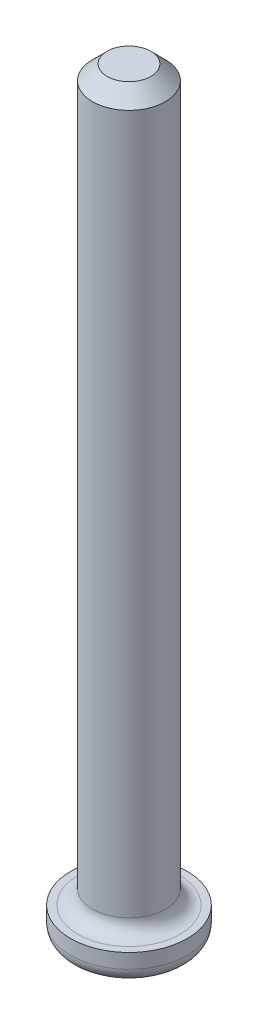
ISO-10303-21;
HEADER;
FILE_DESCRIPTION(('STEP AP214'),'2;1');
FILE_NAME('part.step','',(''),(''),'','','');
FILE_SCHEMA(('AUTOMOTIVE_DESIGN { 1 0 10303 214 1 1 1 1 }'));
ENDSEC;
DATA;
#1=APPLICATION_CONTEXT('core data for automotive mechanical design processes');
#2=APPLICATION_PROTOCOL_DEFINITION('international standard','automotive_design',2000,#1);
#3=PRODUCT_CONTEXT('',#1,'mechanical');
#4=PRODUCT('Part','Part','',(#3));
#5=PRODUCT_RELATED_PRODUCT_CATEGORY('part','',(#4));
#6=PRODUCT_DEFINITION_FORMATION('','',#4);
#7=PRODUCT_DEFINITION_CONTEXT('part definition',#1,'design');
#8=PRODUCT_DEFINITION('design','',#6,#7);
#9=PRODUCT_DEFINITION_SHAPE('','',#8);
#10=(LENGTH_UNIT() NAMED_UNIT(*) SI_UNIT(.MILLI.,.METRE.));
#11=(NAMED_UNIT(*) PLANE_ANGLE_UNIT() SI_UNIT($,.RADIAN.));
#12=(NAMED_UNIT(*) SI_UNIT($,.STERADIAN.) SOLID_ANGLE_UNIT());
#13=UNCERTAINTY_MEASURE_WITH_UNIT(LENGTH_MEASURE(1.E-05),#10,'distance_accuracy_value','');
#14=(GEOMETRIC_REPRESENTATION_CONTEXT(3) GLOBAL_UNCERTAINTY_ASSIGNED_CONTEXT((#13)) GLOBAL_UNIT_ASSIGNED_CONTEXT((#10,
#11,#12)) REPRESENTATION_CONTEXT('',''));
#15=CARTESIAN_POINT('',(0.,0.,0.));
#16=DIRECTION('',(0.,0.,1.));
#17=DIRECTION('',(1.,0.,0.));
#18=AXIS2_PLACEMENT_3D('',#15,#16,#17);
#19=CARTESIAN_POINT('',(0.,2.,0.));
#20=DIRECTION('',(0.,-1.,0.));
#21=DIRECTION('',(0.,0.,-1.));
#22=AXIS2_PLACEMENT_3D('',#19,#20,#21);
#23=CYLINDRICAL_SURFACE('',#22,4.);
#24=CARTESIAN_POINT('',(0.,1.,0.));
#25=DIRECTION('',(0.,1.,0.));
#26=DIRECTION('',(0.,0.,1.));
#27=AXIS2_PLACEMENT_3D('',#24,#25,#26);
#28=CIRCLE('',#27,4.);
#29=CARTESIAN_POINT('',(0.,1.,4.));
#30=VERTEX_POINT('',#29);
#31=EDGE_CURVE('E45',#30,#30,#28,.T.);
#32=ORIENTED_EDGE('',*,*,#31,.T.);
#33=EDGE_LOOP('',(#32));
#34=FACE_BOUND('',#33,.T.);
#35=CARTESIAN_POINT('',(0.,2.,0.));
#36=DIRECTION('',(0.,1.,0.));
#37=DIRECTION('',(0.,0.,1.));
#38=AXIS2_PLACEMENT_3D('',#35,#36,#37);
#39=CIRCLE('',#38,4.);
#40=CARTESIAN_POINT('',(0.,2.,4.));
#41=VERTEX_POINT('',#40);
#42=EDGE_CURVE('E69',#41,#41,#39,.T.);
#43=ORIENTED_EDGE('',*,*,#42,.F.);
#44=EDGE_LOOP('',(#43));
#45=FACE_BOUND('',#44,.T.);
#46=ADVANCED_FACE('F37',(#34,#45),#23,.T.);
#47=CARTESIAN_POINT('',(0.,2.,0.));
#48=DIRECTION('',(0.,1.,0.));
#49=DIRECTION('',(0.,0.,1.));
#50=AXIS2_PLACEMENT_3D('',#47,#48,#49);
#51=PLANE('',#50);
#52=CARTESIAN_POINT('',(0.,2.,0.));
#53=DIRECTION('',(0.,1.,0.));
#54=DIRECTION('',(0.,0.,1.));
#55=AXIS2_PLACEMENT_3D('',#52,#53,#54);
#56=CIRCLE('',#55,3.5);
#57=CARTESIAN_POINT('',(0.,2.,3.5));
#58=VERTEX_POINT('',#57);
#59=EDGE_CURVE('E61',#58,#58,#56,.F.);
#60=ORIENTED_EDGE('',*,*,#59,.T.);
#61=EDGE_LOOP('',(#60));
#62=FACE_BOUND('',#61,.T.);
#63=ORIENTED_EDGE('',*,*,#42,.T.);
#64=EDGE_LOOP('',(#63));
#65=FACE_BOUND('',#64,.T.);
#66=ADVANCED_FACE('F74',(#62,#65),#51,.T.);
#67=CARTESIAN_POINT('',(0.,0.,0.));
#68=DIRECTION('',(0.,1.,0.));
#69=DIRECTION('',(0.,0.,1.));
#70=AXIS2_PLACEMENT_3D('',#67,#68,#69);
#71=PLANE('',#70);
#72=CARTESIAN_POINT('',(0.,0.,0.));
#73=DIRECTION('',(0.,1.,0.));
#74=DIRECTION('',(0.,0.,1.));
#75=AXIS2_PLACEMENT_3D('',#72,#73,#74);
#76=CIRCLE('',#75,3.);
#77=CARTESIAN_POINT('',(0.,0.,3.));
#78=VERTEX_POINT('',#77);
#79=EDGE_CURVE('E10',#78,#78,#76,.F.);
#80=ORIENTED_EDGE('',*,*,#79,.T.);
#81=EDGE_LOOP('',(#80));
#82=FACE_BOUND('',#81,.T.);
#83=ADVANCED_FACE('F81',(#82),#71,.F.);
#84=CARTESIAN_POINT('',(0.,52.,0.));
#85=DIRECTION('',(0.,-1.,0.));
#86=DIRECTION('',(0.,0.,-1.));
#87=AXIS2_PLACEMENT_3D('',#84,#85,#86);
#88=CYLINDRICAL_SURFACE('',#87,2.5);
#89=CARTESIAN_POINT('',(0.,51.,0.));
#90=DIRECTION('',(0.,1.,0.));
#91=DIRECTION('',(0.,0.,1.));
#92=AXIS2_PLACEMENT_3D('',#89,#90,#91);
#93=CIRCLE('',#92,2.5);
#94=CARTESIAN_POINT('',(0.,51.,2.5));
#95=VERTEX_POINT('',#94);
#96=EDGE_CURVE('E50',#95,#95,#93,.F.);
#97=ORIENTED_EDGE('',*,*,#96,.T.);
#98=EDGE_LOOP('',(#97));
#99=FACE_BOUND('',#98,.T.);
#100=CARTESIAN_POINT('',(0.,3.,0.));
#101=DIRECTION('',(0.,1.,0.));
#102=DIRECTION('',(0.,0.,1.));
#103=AXIS2_PLACEMENT_3D('',#100,#101,#102);
#104=CIRCLE('',#103,2.5);
#105=CARTESIAN_POINT('',(0.,3.,2.5));
#106=VERTEX_POINT('',#105);
#107=EDGE_CURVE('E65',#106,#106,#104,.T.);
#108=ORIENTED_EDGE('',*,*,#107,.T.);
#109=EDGE_LOOP('',(#108));
#110=FACE_BOUND('',#109,.T.);
#111=ADVANCED_FACE('F102',(#99,#110),#88,.T.);
#112=CARTESIAN_POINT('',(0.,52.,0.));
#113=DIRECTION('',(0.,1.,0.));
#114=DIRECTION('',(0.,0.,1.));
#115=AXIS2_PLACEMENT_3D('',#112,#113,#114);
#116=PLANE('',#115);
#117=CARTESIAN_POINT('',(0.,52.,0.));
#118=DIRECTION('',(0.,1.,0.));
#119=DIRECTION('',(0.,0.,1.));
#120=AXIS2_PLACEMENT_3D('',#117,#118,#119);
#121=CIRCLE('',#120,1.50000000000001);
#122=CARTESIAN_POINT('',(0.,52.,1.50000000000001));
#123=VERTEX_POINT('',#122);
#124=EDGE_CURVE('E55',#123,#123,#121,.T.);
#125=ORIENTED_EDGE('',*,*,#124,.T.);
#126=EDGE_LOOP('',(#125));
#127=FACE_BOUND('',#126,.T.);
#128=ADVANCED_FACE('F89',(#127),#116,.T.);
#129=CARTESIAN_POINT('',(0.,3.,0.));
#130=DIRECTION('',(0.,1.,0.));
#131=DIRECTION('',(0.,0.,1.));
#132=AXIS2_PLACEMENT_3D('',#129,#130,#131);
#133=TOROIDAL_SURFACE('',#132,3.5,1.);
#134=ORIENTED_EDGE('',*,*,#59,.F.);
#135=EDGE_LOOP('',(#134));
#136=FACE_BOUND('',#135,.T.);
#137=ORIENTED_EDGE('',*,*,#107,.F.);
#138=EDGE_LOOP('',(#137));
#139=FACE_BOUND('',#138,.T.);
#140=ADVANCED_FACE('F86',(#136,#139),#133,.F.);
#141=CARTESIAN_POINT('',(0.,52.,0.));
#142=DIRECTION('',(0.,-1.,0.));
#143=DIRECTION('',(0.,0.,-1.));
#144=AXIS2_PLACEMENT_3D('',#141,#142,#143);
#145=CONICAL_SURFACE('',#144,1.50000000000001,0.785398163397447);
#146=ORIENTED_EDGE('',*,*,#96,.F.);
#147=EDGE_LOOP('',(#146));
#148=FACE_BOUND('',#147,.T.);
#149=ORIENTED_EDGE('',*,*,#124,.F.);
#150=EDGE_LOOP('',(#149));
#151=FACE_BOUND('',#150,.T.);
#152=ADVANCED_FACE('F88',(#148,#151),#145,.T.);
#153=CARTESIAN_POINT('',(0.,1.,0.));
#154=DIRECTION('',(0.,1.,0.));
#155=DIRECTION('',(0.,0.,1.));
#156=AXIS2_PLACEMENT_3D('',#153,#154,#155);
#157=TOROIDAL_SURFACE('',#156,3.,1.);
#158=ORIENTED_EDGE('',*,*,#79,.F.);
#159=EDGE_LOOP('',(#158));
#160=FACE_BOUND('',#159,.T.);
#161=ORIENTED_EDGE('',*,*,#31,.F.);
#162=EDGE_LOOP('',(#161));
#163=FACE_BOUND('',#162,.T.);
#164=ADVANCED_FACE('F39',(#160,#163),#157,.T.);
#165=CLOSED_SHELL('',(#46,#66,#83,#111,#128,#140,#152,#164));
#166=MANIFOLD_SOLID_BREP('B2',#165);
#167=ADVANCED_BREP_SHAPE_REPRESENTATION('',(#18,#166),#14);
#168=SHAPE_DEFINITION_REPRESENTATION(#9,#167);
ENDSEC;
END-ISO-10303-21;
